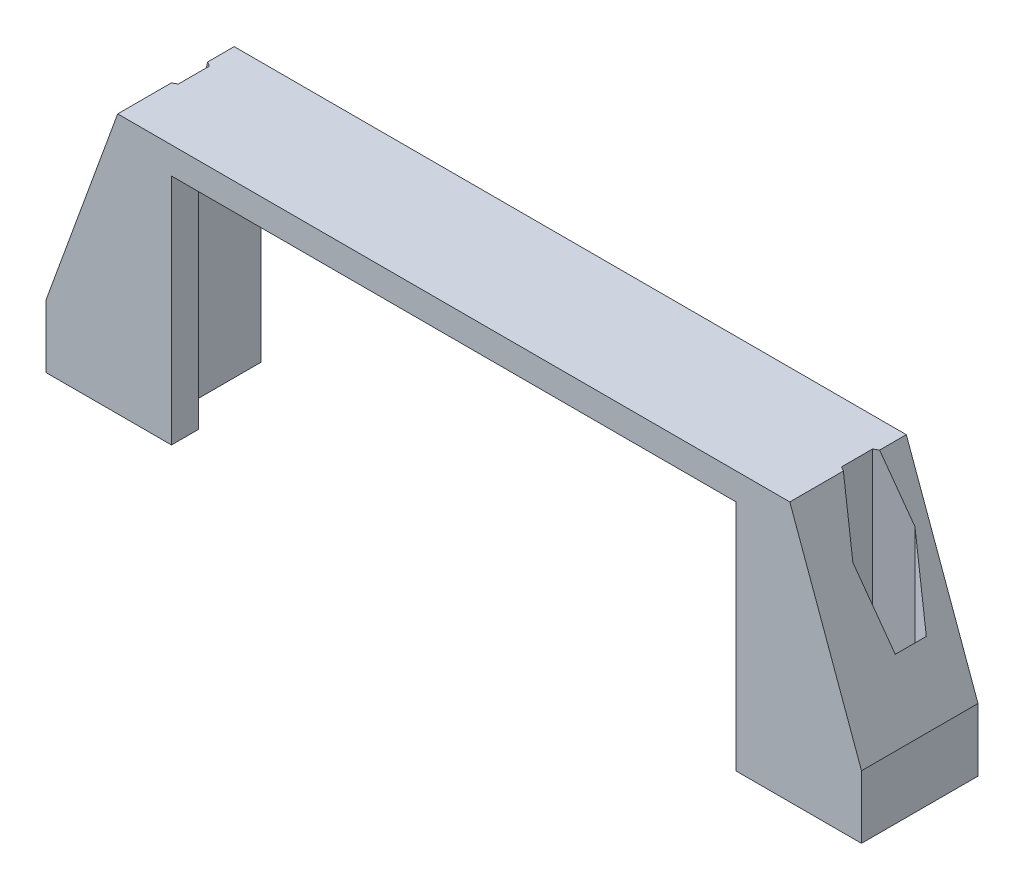
ISO-10303-21;
HEADER;
FILE_DESCRIPTION(('STEP AP214'),'2;1');
FILE_NAME('part.step','',(''),(''),'','','');
FILE_SCHEMA(('AUTOMOTIVE_DESIGN { 1 0 10303 214 1 1 1 1 }'));
ENDSEC;
DATA;
#1=APPLICATION_CONTEXT('core data for automotive mechanical design processes');
#2=APPLICATION_PROTOCOL_DEFINITION('international standard','automotive_design',2000,#1);
#3=PRODUCT_CONTEXT('',#1,'mechanical');
#4=PRODUCT('Part','Part','',(#3));
#5=PRODUCT_RELATED_PRODUCT_CATEGORY('part','',(#4));
#6=PRODUCT_DEFINITION_FORMATION('','',#4);
#7=PRODUCT_DEFINITION_CONTEXT('part definition',#1,'design');
#8=PRODUCT_DEFINITION('design','',#6,#7);
#9=PRODUCT_DEFINITION_SHAPE('','',#8);
#10=(LENGTH_UNIT() NAMED_UNIT(*) SI_UNIT(.MILLI.,.METRE.));
#11=(NAMED_UNIT(*) PLANE_ANGLE_UNIT() SI_UNIT($,.RADIAN.));
#12=(NAMED_UNIT(*) SI_UNIT($,.STERADIAN.) SOLID_ANGLE_UNIT());
#13=UNCERTAINTY_MEASURE_WITH_UNIT(LENGTH_MEASURE(1.E-05),#10,'distance_accuracy_value','');
#14=(GEOMETRIC_REPRESENTATION_CONTEXT(3) GLOBAL_UNCERTAINTY_ASSIGNED_CONTEXT((#13)) GLOBAL_UNIT_ASSIGNED_CONTEXT((#10,
#11,#12)) REPRESENTATION_CONTEXT('',''));
#15=CARTESIAN_POINT('',(0.,0.,0.));
#16=DIRECTION('',(0.,0.,1.));
#17=DIRECTION('',(1.,0.,0.));
#18=AXIS2_PLACEMENT_3D('',#15,#16,#17);
#19=CARTESIAN_POINT('',(45.5,7.02018064436309,10.));
#20=DIRECTION('',(-0.939692620785908,-0.342020143325669,0.));
#21=DIRECTION('',(0.342020143325669,-0.939692620785908,0.));
#22=AXIS2_PLACEMENT_3D('',#19,#20,#21);
#23=PLANE('',#22);
#24=DIRECTION('',(0.335540895264848,-0.921891033043757,0.193724626205288));
#25=VECTOR('',#24,1.);
#26=CARTESIAN_POINT('',(45.3934265183775,7.31298887863358,11.5779978673775));
#27=LINE('',#26,#25);
#28=CARTESIAN_POINT('',(37.5,29.,7.0207259421637));
#29=VERTEX_POINT('',#28);
#30=CARTESIAN_POINT('',(40.,22.1313064513634,8.46410161513775));
#31=VERTEX_POINT('',#30);
#32=EDGE_CURVE('E390',#29,#31,#27,.T.);
#33=ORIENTED_EDGE('',*,*,#32,.F.);
#34=DIRECTION('',(0.,0.,-1.));
#35=VECTOR('',#34,1.);
#36=CARTESIAN_POINT('',(37.5,29.,10.));
#37=LINE('',#36,#35);
#38=CARTESIAN_POINT('',(37.5,29.,13.));
#39=VERTEX_POINT('',#38);
#40=EDGE_CURVE('E416',#39,#29,#37,.T.);
#41=ORIENTED_EDGE('',*,*,#40,.F.);
#42=DIRECTION('',(-0.342020143325669,0.939692620785908,0.));
#43=VECTOR('',#42,1.);
#44=CARTESIAN_POINT('',(45.5,7.02018064436309,13.));
#45=LINE('',#44,#43);
#46=CARTESIAN_POINT('',(45.5,7.02018064436309,13.));
#47=VERTEX_POINT('',#46);
#48=EDGE_CURVE('E477',#47,#39,#45,.T.);
#49=ORIENTED_EDGE('',*,*,#48,.F.);
#50=DIRECTION('',(0.,0.,-1.));
#51=VECTOR('',#50,1.);
#52=CARTESIAN_POINT('',(45.5,7.02018064436309,10.));
#53=LINE('',#52,#51);
#54=CARTESIAN_POINT('',(45.5,7.02018064436309,0.));
#55=VERTEX_POINT('',#54);
#56=EDGE_CURVE('E419',#47,#55,#53,.T.);
#57=ORIENTED_EDGE('',*,*,#56,.T.);
#58=DIRECTION('',(-0.342020143325669,0.939692620785908,0.));
#59=VECTOR('',#58,1.);
#60=CARTESIAN_POINT('',(45.5,7.02018064436309,0.));
#61=LINE('',#60,#59);
#62=CARTESIAN_POINT('',(37.5,29.,0.));
#63=VERTEX_POINT('',#62);
#64=EDGE_CURVE('E401',#55,#63,#61,.T.);
#65=ORIENTED_EDGE('',*,*,#64,.T.);
#66=CARTESIAN_POINT('',(37.5,29.,2.97927405783632));
#67=VERTEX_POINT('',#66);
#68=EDGE_CURVE('E415',#67,#63,#37,.T.);
#69=ORIENTED_EDGE('',*,*,#68,.F.);
#70=DIRECTION('',(-0.335540895264848,0.921891033043757,0.193724626205287));
#71=VECTOR('',#70,1.);
#72=CARTESIAN_POINT('',(44.7434011732598,9.09891883641765,-1.20270555939366));
#73=LINE('',#72,#71);
#74=CARTESIAN_POINT('',(40.,22.1313064513634,1.53589838486225));
#75=VERTEX_POINT('',#74);
#76=EDGE_CURVE('E388',#75,#67,#73,.T.);
#77=ORIENTED_EDGE('',*,*,#76,.F.);
#78=DIRECTION('',(-0.335540895264848,0.921891033043757,-0.193724626205289));
#79=VECTOR('',#78,1.);
#80=CARTESIAN_POINT('',(45.843777287958,6.07566030837702,4.90980477514905));
#81=LINE('',#80,#79);
#82=CARTESIAN_POINT('',(43.,13.8888741929995,3.26794919243114));
#83=VERTEX_POINT('',#82);
#84=EDGE_CURVE('E429',#83,#75,#81,.T.);
#85=ORIENTED_EDGE('',*,*,#84,.F.);
#86=DIRECTION('',(0.,0.,-1.));
#87=VECTOR('',#86,1.);
#88=CARTESIAN_POINT('',(43.,13.8888741929997,9.99999999999996));
#89=LINE('',#88,#87);
#90=CARTESIAN_POINT('',(43.,13.8888741929996,6.73205080756888));
#91=VERTEX_POINT('',#90);
#92=EDGE_CURVE('E54',#91,#83,#89,.T.);
#93=ORIENTED_EDGE('',*,*,#92,.F.);
#94=DIRECTION('',(0.335540895264848,-0.921891033043757,-0.193724626205287));
#95=VECTOR('',#94,1.);
#96=CARTESIAN_POINT('',(45.1937519428403,7.8615902661611,5.46548753283476));
#97=LINE('',#96,#95);
#98=EDGE_CURVE('E11',#31,#91,#97,.T.);
#99=ORIENTED_EDGE('',*,*,#98,.F.);
#100=EDGE_LOOP('',(#33,#41,#49,#57,#65,#69,#77,#85,#93,#99));
#101=FACE_BOUND('',#100,.T.);
#102=ADVANCED_FACE('F45',(#101),#23,.F.);
#103=CARTESIAN_POINT('',(37.5,29.,10.));
#104=DIRECTION('',(0.,-1.,0.));
#105=DIRECTION('',(1.,0.,0.));
#106=AXIS2_PLACEMENT_3D('',#103,#104,#105);
#107=PLANE('',#106);
#108=DIRECTION('',(0.866025403784438,0.,0.500000000000001));
#109=VECTOR('',#108,1.);
#110=CARTESIAN_POINT('',(38.7900635094611,29.,7.76554445662278));
#111=LINE('',#110,#109);
#112=CARTESIAN_POINT('',(37.,29.,6.73205080756888));
#113=VERTEX_POINT('',#112);
#114=EDGE_CURVE('E427',#113,#29,#111,.T.);
#115=ORIENTED_EDGE('',*,*,#114,.F.);
#116=DIRECTION('',(0.,0.,1.));
#117=VECTOR('',#116,1.);
#118=CARTESIAN_POINT('',(37.,29.,10.));
#119=LINE('',#118,#117);
#120=CARTESIAN_POINT('',(37.,29.,3.26794919243113));
#121=VERTEX_POINT('',#120);
#122=EDGE_CURVE('E425',#121,#113,#119,.T.);
#123=ORIENTED_EDGE('',*,*,#122,.F.);
#124=DIRECTION('',(-0.86602540378444,0.,0.499999999999998));
#125=VECTOR('',#124,1.);
#126=CARTESIAN_POINT('',(34.4599364905389,29.,4.73445554337722));
#127=LINE('',#126,#125);
#128=EDGE_CURVE('E423',#67,#121,#127,.T.);
#129=ORIENTED_EDGE('',*,*,#128,.F.);
#130=ORIENTED_EDGE('',*,*,#68,.T.);
#131=DIRECTION('',(-1.,0.,0.));
#132=VECTOR('',#131,1.);
#133=CARTESIAN_POINT('',(37.5,29.,0.));
#134=LINE('',#133,#132);
#135=CARTESIAN_POINT('',(-37.5,29.,0.));
#136=VERTEX_POINT('',#135);
#137=EDGE_CURVE('E404',#63,#136,#134,.T.);
#138=ORIENTED_EDGE('',*,*,#137,.T.);
#139=DIRECTION('',(0.,0.,-1.));
#140=VECTOR('',#139,1.);
#141=CARTESIAN_POINT('',(-37.5,29.,10.));
#142=LINE('',#141,#140);
#143=CARTESIAN_POINT('',(-37.5,29.,2.97927405783632));
#144=VERTEX_POINT('',#143);
#145=EDGE_CURVE('E326',#144,#136,#142,.T.);
#146=ORIENTED_EDGE('',*,*,#145,.F.);
#147=DIRECTION('',(0.86602540378444,0.,0.499999999999998));
#148=VECTOR('',#147,1.);
#149=CARTESIAN_POINT('',(-34.4599364905389,29.,4.73445554337722));
#150=LINE('',#149,#148);
#151=CARTESIAN_POINT('',(-37.,29.,3.26794919243113));
#152=VERTEX_POINT('',#151);
#153=EDGE_CURVE('E336',#144,#152,#150,.T.);
#154=ORIENTED_EDGE('',*,*,#153,.T.);
#155=DIRECTION('',(0.,0.,1.));
#156=VECTOR('',#155,1.);
#157=CARTESIAN_POINT('',(-37.,29.,10.));
#158=LINE('',#157,#156);
#159=CARTESIAN_POINT('',(-37.,29.,6.73205080756888));
#160=VERTEX_POINT('',#159);
#161=EDGE_CURVE('E339',#152,#160,#158,.T.);
#162=ORIENTED_EDGE('',*,*,#161,.T.);
#163=DIRECTION('',(-0.866025403784438,0.,0.500000000000001));
#164=VECTOR('',#163,1.);
#165=CARTESIAN_POINT('',(-38.7900635094611,29.,7.76554445662278));
#166=LINE('',#165,#164);
#167=CARTESIAN_POINT('',(-37.5,29.,7.0207259421637));
#168=VERTEX_POINT('',#167);
#169=EDGE_CURVE('E342',#160,#168,#166,.T.);
#170=ORIENTED_EDGE('',*,*,#169,.T.);
#171=CARTESIAN_POINT('',(-37.5,29.,13.));
#172=VERTEX_POINT('',#171);
#173=EDGE_CURVE('E327',#172,#168,#142,.T.);
#174=ORIENTED_EDGE('',*,*,#173,.F.);
#175=DIRECTION('',(-1.,0.,0.));
#176=VECTOR('',#175,1.);
#177=CARTESIAN_POINT('',(37.5,29.,13.));
#178=LINE('',#177,#176);
#179=EDGE_CURVE('E473',#39,#172,#178,.T.);
#180=ORIENTED_EDGE('',*,*,#179,.F.);
#181=ORIENTED_EDGE('',*,*,#40,.T.);
#182=EDGE_LOOP('',(#115,#123,#129,#130,#138,#146,#154,#162,#170,#174,#180,#181));
#183=FACE_BOUND('',#182,.T.);
#184=ADVANCED_FACE('F455',(#183),#107,.F.);
#185=CARTESIAN_POINT('',(34.5,0.,10.));
#186=DIRECTION('',(0.,1.,0.));
#187=DIRECTION('',(0.,0.,1.));
#188=AXIS2_PLACEMENT_3D('',#185,#186,#187);
#189=PLANE('',#188);
#190=CARTESIAN_POINT('',(40.,0.,5.));
#191=DIRECTION('',(0.,1.,0.));
#192=DIRECTION('',(0.,0.,1.));
#193=AXIS2_PLACEMENT_3D('',#190,#191,#192);
#194=CIRCLE('',#193,1.85);
#195=CARTESIAN_POINT('',(40.,0.,6.85));
#196=VERTEX_POINT('',#195);
#197=EDGE_CURVE('E49',#196,#196,#194,.T.);
#198=ORIENTED_EDGE('',*,*,#197,.T.);
#199=EDGE_LOOP('',(#198));
#200=FACE_BOUND('',#199,.T.);
#201=DIRECTION('',(1.,0.,0.));
#202=VECTOR('',#201,1.);
#203=CARTESIAN_POINT('',(34.5,0.,0.));
#204=LINE('',#203,#202);
#205=CARTESIAN_POINT('',(34.5,0.,0.));
#206=VERTEX_POINT('',#205);
#207=CARTESIAN_POINT('',(45.5,0.,0.));
#208=VERTEX_POINT('',#207);
#209=EDGE_CURVE('E392',#206,#208,#204,.T.);
#210=ORIENTED_EDGE('',*,*,#209,.T.);
#211=DIRECTION('',(0.,0.,-1.));
#212=VECTOR('',#211,1.);
#213=CARTESIAN_POINT('',(45.5,0.,10.));
#214=LINE('',#213,#212);
#215=CARTESIAN_POINT('',(45.5,0.,13.));
#216=VERTEX_POINT('',#215);
#217=EDGE_CURVE('E240',#216,#208,#214,.T.);
#218=ORIENTED_EDGE('',*,*,#217,.F.);
#219=DIRECTION('',(1.,0.,0.));
#220=VECTOR('',#219,1.);
#221=CARTESIAN_POINT('',(31.5,0.,13.));
#222=LINE('',#221,#220);
#223=CARTESIAN_POINT('',(31.5,0.,13.));
#224=VERTEX_POINT('',#223);
#225=EDGE_CURVE('E232',#224,#216,#222,.T.);
#226=ORIENTED_EDGE('',*,*,#225,.F.);
#227=DIRECTION('',(0.,0.,-1.));
#228=VECTOR('',#227,1.);
#229=CARTESIAN_POINT('',(31.5,0.,13.));
#230=LINE('',#229,#228);
#231=CARTESIAN_POINT('',(31.5,0.,10.));
#232=VERTEX_POINT('',#231);
#233=EDGE_CURVE('E237',#224,#232,#230,.T.);
#234=ORIENTED_EDGE('',*,*,#233,.T.);
#235=DIRECTION('',(1.,0.,0.));
#236=VECTOR('',#235,1.);
#237=CARTESIAN_POINT('',(31.5,0.,10.));
#238=LINE('',#237,#236);
#239=CARTESIAN_POINT('',(34.5,0.,10.));
#240=VERTEX_POINT('',#239);
#241=EDGE_CURVE('E493',#232,#240,#238,.T.);
#242=ORIENTED_EDGE('',*,*,#241,.T.);
#243=DIRECTION('',(0.,0.,-1.));
#244=VECTOR('',#243,1.);
#245=CARTESIAN_POINT('',(34.5,0.,10.));
#246=LINE('',#245,#244);
#247=EDGE_CURVE('E397',#240,#206,#246,.T.);
#248=ORIENTED_EDGE('',*,*,#247,.T.);
#249=EDGE_LOOP('',(#210,#218,#226,#234,#242,#248));
#250=FACE_BOUND('',#249,.T.);
#251=ADVANCED_FACE('F47',(#200,#250),#189,.F.);
#252=CARTESIAN_POINT('',(45.5,0.,10.));
#253=DIRECTION('',(-1.,0.,0.));
#254=DIRECTION('',(0.,0.,1.));
#255=AXIS2_PLACEMENT_3D('',#252,#253,#254);
#256=PLANE('',#255);
#257=DIRECTION('',(0.,1.,0.));
#258=VECTOR('',#257,1.);
#259=CARTESIAN_POINT('',(45.5,0.,0.));
#260=LINE('',#259,#258);
#261=EDGE_CURVE('E399',#208,#55,#260,.T.);
#262=ORIENTED_EDGE('',*,*,#261,.T.);
#263=ORIENTED_EDGE('',*,*,#56,.F.);
#264=DIRECTION('',(0.,1.,0.));
#265=VECTOR('',#264,1.);
#266=CARTESIAN_POINT('',(45.5,0.,13.));
#267=LINE('',#266,#265);
#268=EDGE_CURVE('E244',#216,#47,#267,.T.);
#269=ORIENTED_EDGE('',*,*,#268,.F.);
#270=ORIENTED_EDGE('',*,*,#217,.T.);
#271=EDGE_LOOP('',(#262,#263,#269,#270));
#272=FACE_BOUND('',#271,.T.);
#273=ADVANCED_FACE('F548',(#272),#256,.F.);
#274=CARTESIAN_POINT('',(0.,26.,10.));
#275=DIRECTION('',(0.,1.,0.));
#276=DIRECTION('',(0.,0.,1.));
#277=AXIS2_PLACEMENT_3D('',#274,#275,#276);
#278=PLANE('',#277);
#279=DIRECTION('',(1.,0.,0.));
#280=VECTOR('',#279,1.);
#281=CARTESIAN_POINT('',(0.,26.,0.));
#282=LINE('',#281,#280);
#283=CARTESIAN_POINT('',(-34.5,26.,0.));
#284=VERTEX_POINT('',#283);
#285=CARTESIAN_POINT('',(34.5,26.,0.));
#286=VERTEX_POINT('',#285);
#287=EDGE_CURVE('E406',#284,#286,#282,.T.);
#288=ORIENTED_EDGE('',*,*,#287,.T.);
#289=DIRECTION('',(0.,0.,-1.));
#290=VECTOR('',#289,1.);
#291=CARTESIAN_POINT('',(34.5,26.,10.));
#292=LINE('',#291,#290);
#293=CARTESIAN_POINT('',(34.5,26.,10.));
#294=VERTEX_POINT('',#293);
#295=EDGE_CURVE('E412',#294,#286,#292,.T.);
#296=ORIENTED_EDGE('',*,*,#295,.F.);
#297=DIRECTION('',(1.,0.,0.));
#298=VECTOR('',#297,1.);
#299=CARTESIAN_POINT('',(0.,26.,10.));
#300=LINE('',#299,#298);
#301=CARTESIAN_POINT('',(31.5,26.,10.));
#302=VERTEX_POINT('',#301);
#303=EDGE_CURVE('E61',#302,#294,#300,.T.);
#304=ORIENTED_EDGE('',*,*,#303,.F.);
#305=DIRECTION('',(0.,0.,-1.));
#306=VECTOR('',#305,1.);
#307=CARTESIAN_POINT('',(31.5,26.,13.));
#308=LINE('',#307,#306);
#309=CARTESIAN_POINT('',(31.5,26.,13.));
#310=VERTEX_POINT('',#309);
#311=EDGE_CURVE('E491',#310,#302,#308,.T.);
#312=ORIENTED_EDGE('',*,*,#311,.F.);
#313=DIRECTION('',(1.,0.,0.));
#314=VECTOR('',#313,1.);
#315=CARTESIAN_POINT('',(-31.5,26.,13.));
#316=LINE('',#315,#314);
#317=CARTESIAN_POINT('',(-31.5,26.,13.));
#318=VERTEX_POINT('',#317);
#319=EDGE_CURVE('E250',#318,#310,#316,.T.);
#320=ORIENTED_EDGE('',*,*,#319,.F.);
#321=DIRECTION('',(0.,0.,-1.));
#322=VECTOR('',#321,1.);
#323=CARTESIAN_POINT('',(-31.5,26.,13.));
#324=LINE('',#323,#322);
#325=CARTESIAN_POINT('',(-31.5,26.,10.));
#326=VERTEX_POINT('',#325);
#327=EDGE_CURVE('E264',#318,#326,#324,.T.);
#328=ORIENTED_EDGE('',*,*,#327,.T.);
#329=CARTESIAN_POINT('',(-34.5,26.,10.));
#330=VERTEX_POINT('',#329);
#331=EDGE_CURVE('E69',#330,#326,#300,.T.);
#332=ORIENTED_EDGE('',*,*,#331,.F.);
#333=DIRECTION('',(0.,0.,-1.));
#334=VECTOR('',#333,1.);
#335=CARTESIAN_POINT('',(-34.5,26.,10.));
#336=LINE('',#335,#334);
#337=EDGE_CURVE('E323',#330,#284,#336,.T.);
#338=ORIENTED_EDGE('',*,*,#337,.T.);
#339=EDGE_LOOP('',(#288,#296,#304,#312,#320,#328,#332,#338));
#340=FACE_BOUND('',#339,.T.);
#341=ADVANCED_FACE('F500',(#340),#278,.F.);
#342=CARTESIAN_POINT('',(34.5,26.,10.));
#343=DIRECTION('',(1.,0.,0.));
#344=DIRECTION('',(0.,0.,-1.));
#345=AXIS2_PLACEMENT_3D('',#342,#343,#344);
#346=PLANE('',#345);
#347=DIRECTION('',(0.,-1.,0.));
#348=VECTOR('',#347,1.);
#349=CARTESIAN_POINT('',(34.5,26.,0.));
#350=LINE('',#349,#348);
#351=EDGE_CURVE('E408',#286,#206,#350,.T.);
#352=ORIENTED_EDGE('',*,*,#351,.T.);
#353=ORIENTED_EDGE('',*,*,#247,.F.);
#354=DIRECTION('',(0.,-1.,0.));
#355=VECTOR('',#354,1.);
#356=CARTESIAN_POINT('',(34.5,26.,10.));
#357=LINE('',#356,#355);
#358=EDGE_CURVE('E394',#294,#240,#357,.T.);
#359=ORIENTED_EDGE('',*,*,#358,.F.);
#360=ORIENTED_EDGE('',*,*,#295,.T.);
#361=EDGE_LOOP('',(#352,#353,#359,#360));
#362=FACE_BOUND('',#361,.T.);
#363=ADVANCED_FACE('F520',(#362),#346,.F.);
#364=CARTESIAN_POINT('',(0.,0.,0.));
#365=DIRECTION('',(0.,0.,1.));
#366=DIRECTION('',(1.,0.,0.));
#367=AXIS2_PLACEMENT_3D('',#364,#365,#366);
#368=PLANE('',#367);
#369=ORIENTED_EDGE('',*,*,#209,.F.);
#370=ORIENTED_EDGE('',*,*,#351,.F.);
#371=ORIENTED_EDGE('',*,*,#287,.F.);
#372=DIRECTION('',(0.,-1.,0.));
#373=VECTOR('',#372,1.);
#374=CARTESIAN_POINT('',(-34.5,26.,0.));
#375=LINE('',#374,#373);
#376=CARTESIAN_POINT('',(-34.5,0.,0.));
#377=VERTEX_POINT('',#376);
#378=EDGE_CURVE('E312',#284,#377,#375,.T.);
#379=ORIENTED_EDGE('',*,*,#378,.T.);
#380=DIRECTION('',(-1.,0.,0.));
#381=VECTOR('',#380,1.);
#382=CARTESIAN_POINT('',(-34.5,0.,0.));
#383=LINE('',#382,#381);
#384=CARTESIAN_POINT('',(-45.5,0.,0.));
#385=VERTEX_POINT('',#384);
#386=EDGE_CURVE('E308',#377,#385,#383,.T.);
#387=ORIENTED_EDGE('',*,*,#386,.T.);
#388=DIRECTION('',(0.,1.,0.));
#389=VECTOR('',#388,1.);
#390=CARTESIAN_POINT('',(-45.5,0.,0.));
#391=LINE('',#390,#389);
#392=CARTESIAN_POINT('',(-45.5,7.0201806443631,0.));
#393=VERTEX_POINT('',#392);
#394=EDGE_CURVE('E315',#385,#393,#391,.T.);
#395=ORIENTED_EDGE('',*,*,#394,.T.);
#396=DIRECTION('',(0.34202014332567,0.939692620785908,0.));
#397=VECTOR('',#396,1.);
#398=CARTESIAN_POINT('',(-45.5,7.0201806443631,0.));
#399=LINE('',#398,#397);
#400=EDGE_CURVE('E317',#393,#136,#399,.T.);
#401=ORIENTED_EDGE('',*,*,#400,.T.);
#402=ORIENTED_EDGE('',*,*,#137,.F.);
#403=ORIENTED_EDGE('',*,*,#64,.F.);
#404=ORIENTED_EDGE('',*,*,#261,.F.);
#405=EDGE_LOOP('',(#369,#370,#371,#379,#387,#395,#401,#402,#403,#404));
#406=FACE_BOUND('',#405,.T.);
#407=ADVANCED_FACE('F522',(#406),#368,.F.);
#408=CARTESIAN_POINT('',(13.665063509461,47.0201806443631,23.6685842870421));
#409=DIRECTION('',(-0.499999999999998,0.,-0.86602540378444));
#410=DIRECTION('',(-0.86602540378444,0.,0.499999999999998));
#411=AXIS2_PLACEMENT_3D('',#408,#409,#410);
#412=PLANE('',#411);
#413=ORIENTED_EDGE('',*,*,#98,.T.);
#414=DIRECTION('',(0.,-1.,0.));
#415=VECTOR('',#414,1.);
#416=CARTESIAN_POINT('',(43.,47.0201806443631,6.73205080756888));
#417=LINE('',#416,#415);
#418=CARTESIAN_POINT('',(43.,7.02018064436309,6.73205080756888));
#419=VERTEX_POINT('',#418);
#420=EDGE_CURVE('E382',#91,#419,#417,.T.);
#421=ORIENTED_EDGE('',*,*,#420,.T.);
#422=DIRECTION('',(0.86602540378444,0.,-0.499999999999998));
#423=VECTOR('',#422,1.);
#424=CARTESIAN_POINT('',(13.665063509461,7.02018064436308,23.6685842870421));
#425=LINE('',#424,#423);
#426=CARTESIAN_POINT('',(40.,7.02018064436309,8.46410161513775));
#427=VERTEX_POINT('',#426);
#428=EDGE_CURVE('E364',#427,#419,#425,.T.);
#429=ORIENTED_EDGE('',*,*,#428,.F.);
#430=DIRECTION('',(0.,-1.,0.));
#431=VECTOR('',#430,1.);
#432=CARTESIAN_POINT('',(40.,47.0201806443631,8.46410161513775));
#433=LINE('',#432,#431);
#434=EDGE_CURVE('E384',#31,#427,#433,.T.);
#435=ORIENTED_EDGE('',*,*,#434,.F.);
#436=EDGE_LOOP('',(#413,#421,#429,#435));
#437=FACE_BOUND('',#436,.T.);
#438=ADVANCED_FACE('F468',(#437),#412,.T.);
#439=CARTESIAN_POINT('',(43.,47.0201806443631,0.));
#440=DIRECTION('',(-1.,0.,0.));
#441=DIRECTION('',(0.,0.,1.));
#442=AXIS2_PLACEMENT_3D('',#439,#440,#441);
#443=PLANE('',#442);
#444=ORIENTED_EDGE('',*,*,#92,.T.);
#445=DIRECTION('',(0.,-1.,0.));
#446=VECTOR('',#445,1.);
#447=CARTESIAN_POINT('',(43.,47.0201806443631,3.26794919243113));
#448=LINE('',#447,#446);
#449=CARTESIAN_POINT('',(43.,7.02018064436309,3.26794919243113));
#450=VERTEX_POINT('',#449);
#451=EDGE_CURVE('E380',#83,#450,#448,.T.);
#452=ORIENTED_EDGE('',*,*,#451,.T.);
#453=DIRECTION('',(0.,0.,-1.));
#454=VECTOR('',#453,1.);
#455=CARTESIAN_POINT('',(43.,7.02018064436309,0.));
#456=LINE('',#455,#454);
#457=EDGE_CURVE('E367',#419,#450,#456,.T.);
#458=ORIENTED_EDGE('',*,*,#457,.F.);
#459=ORIENTED_EDGE('',*,*,#420,.F.);
#460=EDGE_LOOP('',(#444,#452,#458,#459));
#461=FACE_BOUND('',#460,.T.);
#462=ADVANCED_FACE('F435',(#461),#443,.T.);
#463=CARTESIAN_POINT('',(9.33493649053896,47.0201806443631,-16.1685842870421));
#464=DIRECTION('',(-0.500000000000002,0.,0.866025403784438));
#465=DIRECTION('',(0.866025403784438,0.,0.500000000000002));
#466=AXIS2_PLACEMENT_3D('',#463,#464,#465);
#467=PLANE('',#466);
#468=ORIENTED_EDGE('',*,*,#84,.T.);
#469=DIRECTION('',(0.,-1.,0.));
#470=VECTOR('',#469,1.);
#471=CARTESIAN_POINT('',(40.,47.0201806443631,1.53589838486225));
#472=LINE('',#471,#470);
#473=CARTESIAN_POINT('',(40.,7.02018064436309,1.53589838486225));
#474=VERTEX_POINT('',#473);
#475=EDGE_CURVE('E378',#75,#474,#472,.T.);
#476=ORIENTED_EDGE('',*,*,#475,.T.);
#477=DIRECTION('',(-0.866025403784438,0.,-0.500000000000002));
#478=VECTOR('',#477,1.);
#479=CARTESIAN_POINT('',(9.33493649053896,7.02018064436308,-16.1685842870421));
#480=LINE('',#479,#478);
#481=EDGE_CURVE('E370',#450,#474,#480,.T.);
#482=ORIENTED_EDGE('',*,*,#481,.F.);
#483=ORIENTED_EDGE('',*,*,#451,.F.);
#484=EDGE_LOOP('',(#468,#476,#482,#483));
#485=FACE_BOUND('',#484,.T.);
#486=ADVANCED_FACE('F442',(#485),#467,.T.);
#487=CARTESIAN_POINT('',(37.,47.0201806443631,0.));
#488=DIRECTION('',(1.,0.,0.));
#489=DIRECTION('',(0.,0.,-1.));
#490=AXIS2_PLACEMENT_3D('',#487,#488,#489);
#491=PLANE('',#490);
#492=ORIENTED_EDGE('',*,*,#122,.T.);
#493=DIRECTION('',(0.,-1.,0.));
#494=VECTOR('',#493,1.);
#495=CARTESIAN_POINT('',(37.,47.0201806443631,6.73205080756888));
#496=LINE('',#495,#494);
#497=CARTESIAN_POINT('',(37.,7.02018064436309,6.73205080756888));
#498=VERTEX_POINT('',#497);
#499=EDGE_CURVE('E386',#113,#498,#496,.T.);
#500=ORIENTED_EDGE('',*,*,#499,.T.);
#501=DIRECTION('',(0.,0.,1.));
#502=VECTOR('',#501,1.);
#503=CARTESIAN_POINT('',(37.,7.02018064436309,0.));
#504=LINE('',#503,#502);
#505=CARTESIAN_POINT('',(37.,7.02018064436309,3.26794919243113));
#506=VERTEX_POINT('',#505);
#507=EDGE_CURVE('E358',#506,#498,#504,.T.);
#508=ORIENTED_EDGE('',*,*,#507,.F.);
#509=DIRECTION('',(0.,-1.,0.));
#510=VECTOR('',#509,1.);
#511=CARTESIAN_POINT('',(37.,47.0201806443631,3.26794919243113));
#512=LINE('',#511,#510);
#513=EDGE_CURVE('E376',#121,#506,#512,.T.);
#514=ORIENTED_EDGE('',*,*,#513,.F.);
#515=EDGE_LOOP('',(#492,#500,#508,#514));
#516=FACE_BOUND('',#515,.T.);
#517=ADVANCED_FACE('F458',(#516),#491,.T.);
#518=CARTESIAN_POINT('',(6.33493649053892,47.0201806443631,-10.9724318643355));
#519=DIRECTION('',(0.500000000000001,0.,-0.866025403784438));
#520=DIRECTION('',(-0.866025403784438,0.,-0.500000000000001));
#521=AXIS2_PLACEMENT_3D('',#518,#519,#520);
#522=PLANE('',#521);
#523=ORIENTED_EDGE('',*,*,#32,.T.);
#524=ORIENTED_EDGE('',*,*,#434,.T.);
#525=DIRECTION('',(0.866025403784438,0.,0.500000000000001));
#526=VECTOR('',#525,1.);
#527=CARTESIAN_POINT('',(6.33493649053892,7.02018064436308,-10.9724318643355));
#528=LINE('',#527,#526);
#529=EDGE_CURVE('E361',#498,#427,#528,.T.);
#530=ORIENTED_EDGE('',*,*,#529,.F.);
#531=ORIENTED_EDGE('',*,*,#499,.F.);
#532=ORIENTED_EDGE('',*,*,#114,.T.);
#533=EDGE_LOOP('',(#523,#524,#530,#531,#532));
#534=FACE_BOUND('',#533,.T.);
#535=ADVANCED_FACE('F462',(#534),#522,.T.);
#536=CARTESIAN_POINT('',(10.665063509461,47.0201806443631,18.4724318643354));
#537=DIRECTION('',(0.499999999999998,0.,0.86602540378444));
#538=DIRECTION('',(0.86602540378444,0.,-0.499999999999998));
#539=AXIS2_PLACEMENT_3D('',#536,#537,#538);
#540=PLANE('',#539);
#541=ORIENTED_EDGE('',*,*,#76,.T.);
#542=ORIENTED_EDGE('',*,*,#128,.T.);
#543=ORIENTED_EDGE('',*,*,#513,.T.);
#544=DIRECTION('',(-0.86602540378444,0.,0.499999999999998));
#545=VECTOR('',#544,1.);
#546=CARTESIAN_POINT('',(10.665063509461,7.02018064436308,18.4724318643354));
#547=LINE('',#546,#545);
#548=EDGE_CURVE('E373',#474,#506,#547,.T.);
#549=ORIENTED_EDGE('',*,*,#548,.F.);
#550=ORIENTED_EDGE('',*,*,#475,.F.);
#551=EDGE_LOOP('',(#541,#542,#543,#549,#550));
#552=FACE_BOUND('',#551,.T.);
#553=ADVANCED_FACE('F449',(#552),#540,.T.);
#554=CARTESIAN_POINT('',(0.,7.02018064436308,0.));
#555=DIRECTION('',(0.,1.,0.));
#556=DIRECTION('',(-1.,0.,0.));
#557=AXIS2_PLACEMENT_3D('',#554,#555,#556);
#558=PLANE('',#557);
#559=CARTESIAN_POINT('',(40.,7.02018064436309,5.));
#560=DIRECTION('',(0.,1.,0.));
#561=DIRECTION('',(-1.,0.,0.));
#562=AXIS2_PLACEMENT_3D('',#559,#560,#561);
#563=CIRCLE('',#562,1.85);
#564=CARTESIAN_POINT('',(38.15,7.02018064436309,5.));
#565=VERTEX_POINT('',#564);
#566=EDGE_CURVE('E353',#565,#565,#563,.T.);
#567=ORIENTED_EDGE('',*,*,#566,.F.);
#568=EDGE_LOOP('',(#567));
#569=FACE_BOUND('',#568,.T.);
#570=ORIENTED_EDGE('',*,*,#507,.T.);
#571=ORIENTED_EDGE('',*,*,#529,.T.);
#572=ORIENTED_EDGE('',*,*,#428,.T.);
#573=ORIENTED_EDGE('',*,*,#457,.T.);
#574=ORIENTED_EDGE('',*,*,#481,.T.);
#575=ORIENTED_EDGE('',*,*,#548,.T.);
#576=EDGE_LOOP('',(#570,#571,#572,#573,#574,#575));
#577=FACE_BOUND('',#576,.T.);
#578=ADVANCED_FACE('F466',(#569,#577),#558,.T.);
#579=CARTESIAN_POINT('',(40.,-32.9798193556369,5.));
#580=DIRECTION('',(0.,1.,0.));
#581=DIRECTION('',(-1.,0.,0.));
#582=AXIS2_PLACEMENT_3D('',#579,#580,#581);
#583=CYLINDRICAL_SURFACE('',#582,1.85);
#584=ORIENTED_EDGE('',*,*,#566,.T.);
#585=EDGE_LOOP('',(#584));
#586=FACE_BOUND('',#585,.T.);
#587=ORIENTED_EDGE('',*,*,#197,.F.);
#588=EDGE_LOOP('',(#587));
#589=FACE_BOUND('',#588,.T.);
#590=ADVANCED_FACE('F589',(#586,#589),#583,.F.);
#591=CARTESIAN_POINT('',(-45.5,7.0201806443631,10.));
#592=DIRECTION('',(0.939692620785908,-0.34202014332567,0.));
#593=DIRECTION('',(-0.34202014332567,-0.939692620785908,0.));
#594=AXIS2_PLACEMENT_3D('',#591,#592,#593);
#595=PLANE('',#594);
#596=DIRECTION('',(-0.335540895264848,-0.921891033043757,0.193724626205288));
#597=VECTOR('',#596,1.);
#598=CARTESIAN_POINT('',(-45.3934265183775,7.31298887863358,11.5779978673775));
#599=LINE('',#598,#597);
#600=CARTESIAN_POINT('',(-40.,22.1313064513635,8.46410161513775));
#601=VERTEX_POINT('',#600);
#602=EDGE_CURVE('E305',#168,#601,#599,.T.);
#603=ORIENTED_EDGE('',*,*,#602,.T.);
#604=DIRECTION('',(-0.335540895264848,-0.921891033043757,-0.193724626205287));
#605=VECTOR('',#604,1.);
#606=CARTESIAN_POINT('',(-45.1937519428403,7.86159026616111,5.46548753283476));
#607=LINE('',#606,#605);
#608=CARTESIAN_POINT('',(-43.,13.8888741929996,6.73205080756888));
#609=VERTEX_POINT('',#608);
#610=EDGE_CURVE('E350',#601,#609,#607,.T.);
#611=ORIENTED_EDGE('',*,*,#610,.T.);
#612=DIRECTION('',(0.,0.,-1.));
#613=VECTOR('',#612,1.);
#614=CARTESIAN_POINT('',(-43.,13.8888741929997,9.99999999999996));
#615=LINE('',#614,#613);
#616=CARTESIAN_POINT('',(-43.,13.8888741929995,3.26794919243114));
#617=VERTEX_POINT('',#616);
#618=EDGE_CURVE('E347',#609,#617,#615,.T.);
#619=ORIENTED_EDGE('',*,*,#618,.T.);
#620=DIRECTION('',(0.335540895264848,0.921891033043757,-0.193724626205289));
#621=VECTOR('',#620,1.);
#622=CARTESIAN_POINT('',(-45.843777287958,6.07566030837703,4.90980477514905));
#623=LINE('',#622,#621);
#624=CARTESIAN_POINT('',(-40.,22.1313064513635,1.53589838486225));
#625=VERTEX_POINT('',#624);
#626=EDGE_CURVE('E344',#617,#625,#623,.T.);
#627=ORIENTED_EDGE('',*,*,#626,.T.);
#628=DIRECTION('',(0.335540895264848,0.921891033043757,0.193724626205287));
#629=VECTOR('',#628,1.);
#630=CARTESIAN_POINT('',(-44.7434011732598,9.09891883641765,-1.20270555939366));
#631=LINE('',#630,#629);
#632=EDGE_CURVE('E302',#625,#144,#631,.T.);
#633=ORIENTED_EDGE('',*,*,#632,.T.);
#634=ORIENTED_EDGE('',*,*,#145,.T.);
#635=ORIENTED_EDGE('',*,*,#400,.F.);
#636=DIRECTION('',(0.,0.,-1.));
#637=VECTOR('',#636,1.);
#638=CARTESIAN_POINT('',(-45.5,7.0201806443631,10.));
#639=LINE('',#638,#637);
#640=CARTESIAN_POINT('',(-45.5,7.0201806443631,13.));
#641=VERTEX_POINT('',#640);
#642=EDGE_CURVE('E330',#641,#393,#639,.T.);
#643=ORIENTED_EDGE('',*,*,#642,.F.);
#644=DIRECTION('',(-0.34202014332567,-0.939692620785908,0.));
#645=VECTOR('',#644,1.);
#646=CARTESIAN_POINT('',(-37.5,29.,13.));
#647=LINE('',#646,#645);
#648=EDGE_CURVE('E476',#172,#641,#647,.T.);
#649=ORIENTED_EDGE('',*,*,#648,.F.);
#650=ORIENTED_EDGE('',*,*,#173,.T.);
#651=EDGE_LOOP('',(#603,#611,#619,#627,#633,#634,#635,#643,#649,#650));
#652=FACE_BOUND('',#651,.T.);
#653=ADVANCED_FACE('F562',(#652),#595,.F.);
#654=CARTESIAN_POINT('',(-34.5,0.,10.));
#655=DIRECTION('',(0.,1.,0.));
#656=DIRECTION('',(0.,0.,1.));
#657=AXIS2_PLACEMENT_3D('',#654,#655,#656);
#658=PLANE('',#657);
#659=CARTESIAN_POINT('',(-40.,0.,5.));
#660=DIRECTION('',(0.,-1.,0.));
#661=DIRECTION('',(0.,0.,1.));
#662=AXIS2_PLACEMENT_3D('',#659,#660,#661);
#663=CIRCLE('',#662,1.85);
#664=CARTESIAN_POINT('',(-40.,0.,6.85));
#665=VERTEX_POINT('',#664);
#666=EDGE_CURVE('E261',#665,#665,#663,.T.);
#667=ORIENTED_EDGE('',*,*,#666,.F.);
#668=EDGE_LOOP('',(#667));
#669=FACE_BOUND('',#668,.T.);
#670=ORIENTED_EDGE('',*,*,#386,.F.);
#671=DIRECTION('',(0.,0.,-1.));
#672=VECTOR('',#671,1.);
#673=CARTESIAN_POINT('',(-34.5,0.,10.));
#674=LINE('',#673,#672);
#675=CARTESIAN_POINT('',(-34.5,0.,10.));
#676=VERTEX_POINT('',#675);
#677=EDGE_CURVE('E311',#676,#377,#674,.T.);
#678=ORIENTED_EDGE('',*,*,#677,.F.);
#679=DIRECTION('',(1.,0.,0.));
#680=VECTOR('',#679,1.);
#681=CARTESIAN_POINT('',(-45.5,0.,10.));
#682=LINE('',#681,#680);
#683=CARTESIAN_POINT('',(-31.5,0.,10.));
#684=VERTEX_POINT('',#683);
#685=EDGE_CURVE('E495',#676,#684,#682,.T.);
#686=ORIENTED_EDGE('',*,*,#685,.T.);
#687=DIRECTION('',(0.,0.,-1.));
#688=VECTOR('',#687,1.);
#689=CARTESIAN_POINT('',(-31.5,0.,13.));
#690=LINE('',#689,#688);
#691=CARTESIAN_POINT('',(-31.5,0.,13.));
#692=VERTEX_POINT('',#691);
#693=EDGE_CURVE('E258',#692,#684,#690,.T.);
#694=ORIENTED_EDGE('',*,*,#693,.F.);
#695=DIRECTION('',(1.,0.,0.));
#696=VECTOR('',#695,1.);
#697=CARTESIAN_POINT('',(-45.5,0.,13.));
#698=LINE('',#697,#696);
#699=CARTESIAN_POINT('',(-45.5,0.,13.));
#700=VERTEX_POINT('',#699);
#701=EDGE_CURVE('E486',#700,#692,#698,.T.);
#702=ORIENTED_EDGE('',*,*,#701,.F.);
#703=DIRECTION('',(0.,0.,-1.));
#704=VECTOR('',#703,1.);
#705=CARTESIAN_POINT('',(-45.5,0.,10.));
#706=LINE('',#705,#704);
#707=EDGE_CURVE('E333',#700,#385,#706,.T.);
#708=ORIENTED_EDGE('',*,*,#707,.T.);
#709=EDGE_LOOP('',(#670,#678,#686,#694,#702,#708));
#710=FACE_BOUND('',#709,.T.);
#711=ADVANCED_FACE('F511',(#669,#710),#658,.F.);
#712=CARTESIAN_POINT('',(-45.5,0.,10.));
#713=DIRECTION('',(1.,0.,0.));
#714=DIRECTION('',(0.,0.,1.));
#715=AXIS2_PLACEMENT_3D('',#712,#713,#714);
#716=PLANE('',#715);
#717=ORIENTED_EDGE('',*,*,#394,.F.);
#718=ORIENTED_EDGE('',*,*,#707,.F.);
#719=DIRECTION('',(0.,-1.,0.));
#720=VECTOR('',#719,1.);
#721=CARTESIAN_POINT('',(-45.5,7.0201806443631,13.));
#722=LINE('',#721,#720);
#723=EDGE_CURVE('E479',#641,#700,#722,.T.);
#724=ORIENTED_EDGE('',*,*,#723,.F.);
#725=ORIENTED_EDGE('',*,*,#642,.T.);
#726=EDGE_LOOP('',(#717,#718,#724,#725));
#727=FACE_BOUND('',#726,.T.);
#728=ADVANCED_FACE('F577',(#727),#716,.F.);
#729=CARTESIAN_POINT('',(-34.5,26.,10.));
#730=DIRECTION('',(-1.,0.,0.));
#731=DIRECTION('',(0.,0.,-1.));
#732=AXIS2_PLACEMENT_3D('',#729,#730,#731);
#733=PLANE('',#732);
#734=ORIENTED_EDGE('',*,*,#378,.F.);
#735=ORIENTED_EDGE('',*,*,#337,.F.);
#736=DIRECTION('',(0.,-1.,0.));
#737=VECTOR('',#736,1.);
#738=CARTESIAN_POINT('',(-34.5,26.,10.));
#739=LINE('',#738,#737);
#740=EDGE_CURVE('E309',#330,#676,#739,.T.);
#741=ORIENTED_EDGE('',*,*,#740,.T.);
#742=ORIENTED_EDGE('',*,*,#677,.T.);
#743=EDGE_LOOP('',(#734,#735,#741,#742));
#744=FACE_BOUND('',#743,.T.);
#745=ADVANCED_FACE('F515',(#744),#733,.F.);
#746=CARTESIAN_POINT('',(-13.665063509461,47.0201806443631,23.6685842870421));
#747=DIRECTION('',(0.499999999999998,0.,-0.86602540378444));
#748=DIRECTION('',(0.86602540378444,0.,0.499999999999998));
#749=AXIS2_PLACEMENT_3D('',#746,#747,#748);
#750=PLANE('',#749);
#751=ORIENTED_EDGE('',*,*,#610,.F.);
#752=DIRECTION('',(0.,-1.,0.));
#753=VECTOR('',#752,1.);
#754=CARTESIAN_POINT('',(-40.,47.0201806443631,8.46410161513775));
#755=LINE('',#754,#753);
#756=CARTESIAN_POINT('',(-40.,7.02018064436309,8.46410161513775));
#757=VERTEX_POINT('',#756);
#758=EDGE_CURVE('E296',#601,#757,#755,.T.);
#759=ORIENTED_EDGE('',*,*,#758,.T.);
#760=DIRECTION('',(-0.86602540378444,0.,-0.499999999999998));
#761=VECTOR('',#760,1.);
#762=CARTESIAN_POINT('',(-13.665063509461,7.02018064436309,23.6685842870421));
#763=LINE('',#762,#761);
#764=CARTESIAN_POINT('',(-43.,7.02018064436309,6.73205080756888));
#765=VERTEX_POINT('',#764);
#766=EDGE_CURVE('E273',#757,#765,#763,.T.);
#767=ORIENTED_EDGE('',*,*,#766,.T.);
#768=DIRECTION('',(0.,-1.,0.));
#769=VECTOR('',#768,1.);
#770=CARTESIAN_POINT('',(-43.,47.0201806443631,6.73205080756888));
#771=LINE('',#770,#769);
#772=EDGE_CURVE('E293',#609,#765,#771,.T.);
#773=ORIENTED_EDGE('',*,*,#772,.F.);
#774=EDGE_LOOP('',(#751,#759,#767,#773));
#775=FACE_BOUND('',#774,.T.);
#776=ADVANCED_FACE('F583',(#775),#750,.T.);
#777=CARTESIAN_POINT('',(-43.,47.0201806443631,0.));
#778=DIRECTION('',(1.,0.,0.));
#779=DIRECTION('',(0.,0.,1.));
#780=AXIS2_PLACEMENT_3D('',#777,#778,#779);
#781=PLANE('',#780);
#782=ORIENTED_EDGE('',*,*,#618,.F.);
#783=ORIENTED_EDGE('',*,*,#772,.T.);
#784=DIRECTION('',(0.,0.,-1.));
#785=VECTOR('',#784,1.);
#786=CARTESIAN_POINT('',(-43.,7.02018064436309,0.));
#787=LINE('',#786,#785);
#788=CARTESIAN_POINT('',(-43.,7.02018064436309,3.26794919243113));
#789=VERTEX_POINT('',#788);
#790=EDGE_CURVE('E276',#765,#789,#787,.T.);
#791=ORIENTED_EDGE('',*,*,#790,.T.);
#792=DIRECTION('',(0.,-1.,0.));
#793=VECTOR('',#792,1.);
#794=CARTESIAN_POINT('',(-43.,47.0201806443631,3.26794919243113));
#795=LINE('',#794,#793);
#796=EDGE_CURVE('E290',#617,#789,#795,.T.);
#797=ORIENTED_EDGE('',*,*,#796,.F.);
#798=EDGE_LOOP('',(#782,#783,#791,#797));
#799=FACE_BOUND('',#798,.T.);
#800=ADVANCED_FACE('F680',(#799),#781,.T.);
#801=CARTESIAN_POINT('',(-9.33493649053895,47.0201806443631,-16.1685842870421));
#802=DIRECTION('',(0.500000000000002,0.,0.866025403784438));
#803=DIRECTION('',(-0.866025403784438,0.,0.500000000000002));
#804=AXIS2_PLACEMENT_3D('',#801,#802,#803);
#805=PLANE('',#804);
#806=ORIENTED_EDGE('',*,*,#626,.F.);
#807=ORIENTED_EDGE('',*,*,#796,.T.);
#808=DIRECTION('',(0.866025403784438,0.,-0.500000000000002));
#809=VECTOR('',#808,1.);
#810=CARTESIAN_POINT('',(-9.33493649053896,7.02018064436308,-16.1685842870421));
#811=LINE('',#810,#809);
#812=CARTESIAN_POINT('',(-40.,7.02018064436309,1.53589838486225));
#813=VERTEX_POINT('',#812);
#814=EDGE_CURVE('E279',#789,#813,#811,.T.);
#815=ORIENTED_EDGE('',*,*,#814,.T.);
#816=DIRECTION('',(0.,-1.,0.));
#817=VECTOR('',#816,1.);
#818=CARTESIAN_POINT('',(-40.,47.0201806443631,1.53589838486225));
#819=LINE('',#818,#817);
#820=EDGE_CURVE('E287',#625,#813,#819,.T.);
#821=ORIENTED_EDGE('',*,*,#820,.F.);
#822=EDGE_LOOP('',(#806,#807,#815,#821));
#823=FACE_BOUND('',#822,.T.);
#824=ADVANCED_FACE('F677',(#823),#805,.T.);
#825=CARTESIAN_POINT('',(-37.,47.0201806443631,0.));
#826=DIRECTION('',(-1.,0.,0.));
#827=DIRECTION('',(0.,0.,-1.));
#828=AXIS2_PLACEMENT_3D('',#825,#826,#827);
#829=PLANE('',#828);
#830=ORIENTED_EDGE('',*,*,#161,.F.);
#831=DIRECTION('',(0.,-1.,0.));
#832=VECTOR('',#831,1.);
#833=CARTESIAN_POINT('',(-37.,47.0201806443631,3.26794919243113));
#834=LINE('',#833,#832);
#835=CARTESIAN_POINT('',(-37.,7.02018064436309,3.26794919243113));
#836=VERTEX_POINT('',#835);
#837=EDGE_CURVE('E284',#152,#836,#834,.T.);
#838=ORIENTED_EDGE('',*,*,#837,.T.);
#839=DIRECTION('',(0.,0.,1.));
#840=VECTOR('',#839,1.);
#841=CARTESIAN_POINT('',(-37.,7.02018064436309,0.));
#842=LINE('',#841,#840);
#843=CARTESIAN_POINT('',(-37.,7.02018064436309,6.73205080756888));
#844=VERTEX_POINT('',#843);
#845=EDGE_CURVE('E268',#836,#844,#842,.T.);
#846=ORIENTED_EDGE('',*,*,#845,.T.);
#847=DIRECTION('',(0.,-1.,0.));
#848=VECTOR('',#847,1.);
#849=CARTESIAN_POINT('',(-37.,47.0201806443631,6.73205080756888));
#850=LINE('',#849,#848);
#851=EDGE_CURVE('E299',#160,#844,#850,.T.);
#852=ORIENTED_EDGE('',*,*,#851,.F.);
#853=EDGE_LOOP('',(#830,#838,#846,#852));
#854=FACE_BOUND('',#853,.T.);
#855=ADVANCED_FACE('F569',(#854),#829,.T.);
#856=CARTESIAN_POINT('',(-6.33493649053891,47.0201806443631,-10.9724318643355));
#857=DIRECTION('',(-0.500000000000001,0.,-0.866025403784438));
#858=DIRECTION('',(0.866025403784438,0.,-0.500000000000001));
#859=AXIS2_PLACEMENT_3D('',#856,#857,#858);
#860=PLANE('',#859);
#861=ORIENTED_EDGE('',*,*,#602,.F.);
#862=ORIENTED_EDGE('',*,*,#169,.F.);
#863=ORIENTED_EDGE('',*,*,#851,.T.);
#864=DIRECTION('',(-0.866025403784438,0.,0.500000000000001));
#865=VECTOR('',#864,1.);
#866=CARTESIAN_POINT('',(-6.33493649053892,7.02018064436308,-10.9724318643355));
#867=LINE('',#866,#865);
#868=EDGE_CURVE('E271',#844,#757,#867,.T.);
#869=ORIENTED_EDGE('',*,*,#868,.T.);
#870=ORIENTED_EDGE('',*,*,#758,.F.);
#871=EDGE_LOOP('',(#861,#862,#863,#869,#870));
#872=FACE_BOUND('',#871,.T.);
#873=ADVANCED_FACE('F573',(#872),#860,.T.);
#874=CARTESIAN_POINT('',(-10.665063509461,47.0201806443631,18.4724318643354));
#875=DIRECTION('',(-0.499999999999998,0.,0.86602540378444));
#876=DIRECTION('',(-0.86602540378444,0.,-0.499999999999998));
#877=AXIS2_PLACEMENT_3D('',#874,#875,#876);
#878=PLANE('',#877);
#879=ORIENTED_EDGE('',*,*,#632,.F.);
#880=ORIENTED_EDGE('',*,*,#820,.T.);
#881=DIRECTION('',(0.86602540378444,0.,0.499999999999998));
#882=VECTOR('',#881,1.);
#883=CARTESIAN_POINT('',(-10.665063509461,7.02018064436309,18.4724318643354));
#884=LINE('',#883,#882);
#885=EDGE_CURVE('E282',#813,#836,#884,.T.);
#886=ORIENTED_EDGE('',*,*,#885,.T.);
#887=ORIENTED_EDGE('',*,*,#837,.F.);
#888=ORIENTED_EDGE('',*,*,#153,.F.);
#889=EDGE_LOOP('',(#879,#880,#886,#887,#888));
#890=FACE_BOUND('',#889,.T.);
#891=ADVANCED_FACE('F565',(#890),#878,.T.);
#892=CARTESIAN_POINT('',(0.,7.02018064436308,0.));
#893=DIRECTION('',(0.,1.,0.));
#894=DIRECTION('',(1.,0.,0.));
#895=AXIS2_PLACEMENT_3D('',#892,#893,#894);
#896=PLANE('',#895);
#897=CARTESIAN_POINT('',(-40.,7.02018064436309,5.));
#898=DIRECTION('',(0.,-1.,0.));
#899=DIRECTION('',(1.,0.,0.));
#900=AXIS2_PLACEMENT_3D('',#897,#898,#899);
#901=CIRCLE('',#900,1.85);
#902=CARTESIAN_POINT('',(-38.15,7.02018064436309,5.));
#903=VERTEX_POINT('',#902);
#904=EDGE_CURVE('E257',#903,#903,#901,.T.);
#905=ORIENTED_EDGE('',*,*,#904,.T.);
#906=EDGE_LOOP('',(#905));
#907=FACE_BOUND('',#906,.T.);
#908=ORIENTED_EDGE('',*,*,#845,.F.);
#909=ORIENTED_EDGE('',*,*,#885,.F.);
#910=ORIENTED_EDGE('',*,*,#814,.F.);
#911=ORIENTED_EDGE('',*,*,#790,.F.);
#912=ORIENTED_EDGE('',*,*,#766,.F.);
#913=ORIENTED_EDGE('',*,*,#868,.F.);
#914=EDGE_LOOP('',(#908,#909,#910,#911,#912,#913));
#915=FACE_BOUND('',#914,.T.);
#916=ADVANCED_FACE('F535',(#907,#915),#896,.T.);
#917=CARTESIAN_POINT('',(-40.,-32.9798193556369,5.));
#918=DIRECTION('',(0.,1.,0.));
#919=DIRECTION('',(1.,0.,0.));
#920=AXIS2_PLACEMENT_3D('',#917,#918,#919);
#921=CYLINDRICAL_SURFACE('',#920,1.85);
#922=ORIENTED_EDGE('',*,*,#904,.F.);
#923=EDGE_LOOP('',(#922));
#924=FACE_BOUND('',#923,.T.);
#925=ORIENTED_EDGE('',*,*,#666,.T.);
#926=EDGE_LOOP('',(#925));
#927=FACE_BOUND('',#926,.T.);
#928=ADVANCED_FACE('F527',(#924,#927),#921,.F.);
#929=CARTESIAN_POINT('',(0.,0.,10.));
#930=DIRECTION('',(0.,0.,1.));
#931=DIRECTION('',(1.,0.,0.));
#932=AXIS2_PLACEMENT_3D('',#929,#930,#931);
#933=PLANE('',#932);
#934=DIRECTION('',(0.,-1.,0.));
#935=VECTOR('',#934,1.);
#936=CARTESIAN_POINT('',(31.5,26.,10.));
#937=LINE('',#936,#935);
#938=EDGE_CURVE('E256',#302,#232,#937,.T.);
#939=ORIENTED_EDGE('',*,*,#938,.F.);
#940=ORIENTED_EDGE('',*,*,#303,.T.);
#941=ORIENTED_EDGE('',*,*,#358,.T.);
#942=ORIENTED_EDGE('',*,*,#241,.F.);
#943=EDGE_LOOP('',(#939,#940,#941,#942));
#944=FACE_BOUND('',#943,.T.);
#945=ADVANCED_FACE('F525',(#944),#933,.F.);
#946=CARTESIAN_POINT('',(31.5,26.,13.));
#947=DIRECTION('',(1.,0.,0.));
#948=DIRECTION('',(0.,1.,0.));
#949=AXIS2_PLACEMENT_3D('',#946,#947,#948);
#950=PLANE('',#949);
#951=ORIENTED_EDGE('',*,*,#938,.T.);
#952=ORIENTED_EDGE('',*,*,#233,.F.);
#953=DIRECTION('',(0.,-1.,0.));
#954=VECTOR('',#953,1.);
#955=CARTESIAN_POINT('',(31.5,26.,13.));
#956=LINE('',#955,#954);
#957=EDGE_CURVE('E245',#310,#224,#956,.T.);
#958=ORIENTED_EDGE('',*,*,#957,.F.);
#959=ORIENTED_EDGE('',*,*,#311,.T.);
#960=EDGE_LOOP('',(#951,#952,#958,#959));
#961=FACE_BOUND('',#960,.T.);
#962=ADVANCED_FACE('F254',(#961),#950,.F.);
#963=CARTESIAN_POINT('',(-31.5,0.,13.));
#964=DIRECTION('',(-1.,0.,0.));
#965=DIRECTION('',(0.,0.,1.));
#966=AXIS2_PLACEMENT_3D('',#963,#964,#965);
#967=PLANE('',#966);
#968=DIRECTION('',(0.,1.,0.));
#969=VECTOR('',#968,1.);
#970=CARTESIAN_POINT('',(-31.5,0.,10.));
#971=LINE('',#970,#969);
#972=EDGE_CURVE('E252',#684,#326,#971,.T.);
#973=ORIENTED_EDGE('',*,*,#972,.T.);
#974=ORIENTED_EDGE('',*,*,#327,.F.);
#975=DIRECTION('',(0.,1.,0.));
#976=VECTOR('',#975,1.);
#977=CARTESIAN_POINT('',(-31.5,0.,13.));
#978=LINE('',#977,#976);
#979=EDGE_CURVE('E488',#692,#318,#978,.T.);
#980=ORIENTED_EDGE('',*,*,#979,.F.);
#981=ORIENTED_EDGE('',*,*,#693,.T.);
#982=EDGE_LOOP('',(#973,#974,#980,#981));
#983=FACE_BOUND('',#982,.T.);
#984=ADVANCED_FACE('F504',(#983),#967,.F.);
#985=CARTESIAN_POINT('',(0.,0.,13.));
#986=DIRECTION('',(0.,0.,1.));
#987=DIRECTION('',(1.,0.,0.));
#988=AXIS2_PLACEMENT_3D('',#985,#986,#987);
#989=PLANE('',#988);
#990=ORIENTED_EDGE('',*,*,#957,.T.);
#991=ORIENTED_EDGE('',*,*,#225,.T.);
#992=ORIENTED_EDGE('',*,*,#268,.T.);
#993=ORIENTED_EDGE('',*,*,#48,.T.);
#994=ORIENTED_EDGE('',*,*,#179,.T.);
#995=ORIENTED_EDGE('',*,*,#648,.T.);
#996=ORIENTED_EDGE('',*,*,#723,.T.);
#997=ORIENTED_EDGE('',*,*,#701,.T.);
#998=ORIENTED_EDGE('',*,*,#979,.T.);
#999=ORIENTED_EDGE('',*,*,#319,.T.);
#1000=EDGE_LOOP('',(#990,#991,#992,#993,#994,#995,#996,#997,#998,#999));
#1001=FACE_BOUND('',#1000,.T.);
#1002=ADVANCED_FACE('F248',(#1001),#989,.T.);
#1003=ORIENTED_EDGE('',*,*,#740,.F.);
#1004=ORIENTED_EDGE('',*,*,#331,.T.);
#1005=ORIENTED_EDGE('',*,*,#972,.F.);
#1006=ORIENTED_EDGE('',*,*,#685,.F.);
#1007=EDGE_LOOP('',(#1003,#1004,#1005,#1006));
#1008=FACE_BOUND('',#1007,.T.);
#1009=ADVANCED_FACE('F507',(#1008),#933,.F.);
#1010=CLOSED_SHELL('',(#102,#184,#251,#273,#341,#363,#407,#438,#462,#486,#517,#535,#553,#578,
#590,#653,#711,#728,#745,#776,#800,#824,#855,#873,#891,#916,#928,#945,#962,#984,#1002,#1009));
#1011=MANIFOLD_SOLID_BREP('B2',#1010);
#1012=ADVANCED_BREP_SHAPE_REPRESENTATION('',(#18,#1011),#14);
#1013=SHAPE_DEFINITION_REPRESENTATION(#9,#1012);
ENDSEC;
END-ISO-10303-21;
